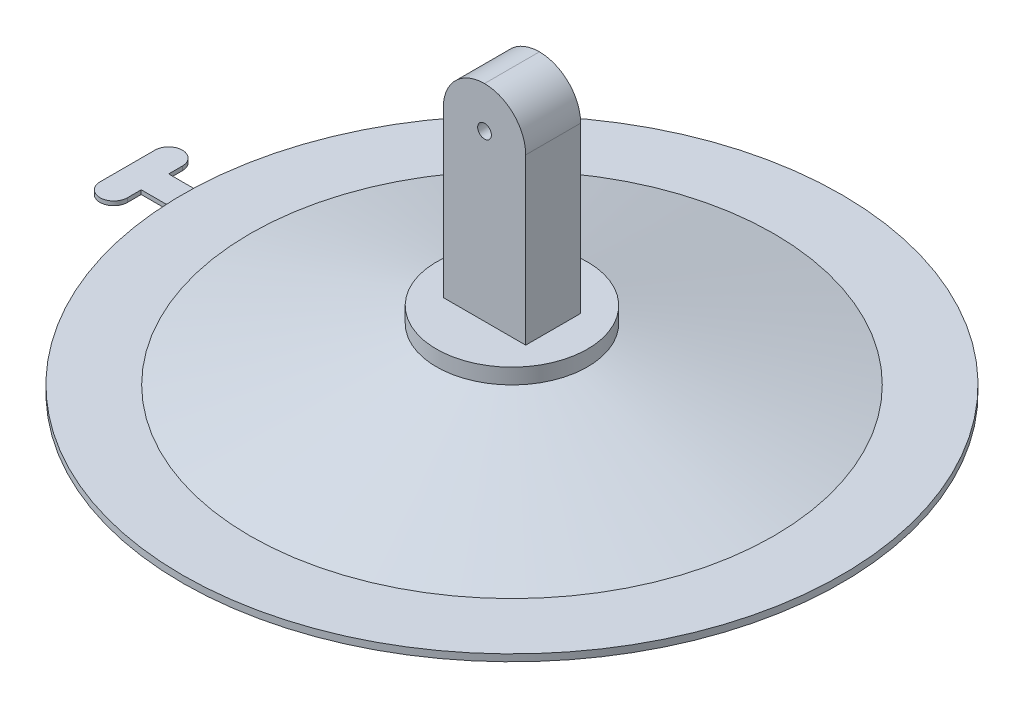
ISO-10303-21;
HEADER;
FILE_DESCRIPTION(('STEP AP214'),'2;1');
FILE_NAME('part.step','',(''),(''),'','','');
FILE_SCHEMA(('AUTOMOTIVE_DESIGN { 1 0 10303 214 1 1 1 1 }'));
ENDSEC;
DATA;
#1=APPLICATION_CONTEXT('core data for automotive mechanical design processes');
#2=APPLICATION_PROTOCOL_DEFINITION('international standard','automotive_design',2000,#1);
#3=PRODUCT_CONTEXT('',#1,'mechanical');
#4=PRODUCT('Part','Part','',(#3));
#5=PRODUCT_RELATED_PRODUCT_CATEGORY('part','',(#4));
#6=PRODUCT_DEFINITION_FORMATION('','',#4);
#7=PRODUCT_DEFINITION_CONTEXT('part definition',#1,'design');
#8=PRODUCT_DEFINITION('design','',#6,#7);
#9=PRODUCT_DEFINITION_SHAPE('','',#8);
#10=(LENGTH_UNIT() NAMED_UNIT(*) SI_UNIT(.MILLI.,.METRE.));
#11=(NAMED_UNIT(*) PLANE_ANGLE_UNIT() SI_UNIT($,.RADIAN.));
#12=(NAMED_UNIT(*) SI_UNIT($,.STERADIAN.) SOLID_ANGLE_UNIT());
#13=UNCERTAINTY_MEASURE_WITH_UNIT(LENGTH_MEASURE(1.E-05),#10,'distance_accuracy_value','');
#14=(GEOMETRIC_REPRESENTATION_CONTEXT(3) GLOBAL_UNCERTAINTY_ASSIGNED_CONTEXT((#13)) GLOBAL_UNIT_ASSIGNED_CONTEXT((#10,
#11,#12)) REPRESENTATION_CONTEXT('',''));
#15=CARTESIAN_POINT('',(0.,0.,0.));
#16=DIRECTION('',(0.,0.,1.));
#17=DIRECTION('',(1.,0.,0.));
#18=AXIS2_PLACEMENT_3D('',#15,#16,#17);
#19=CARTESIAN_POINT('',(-3.,20.5,-2.));
#20=DIRECTION('',(1.,0.,0.));
#21=DIRECTION('',(0.,0.,-1.));
#22=AXIS2_PLACEMENT_3D('',#19,#20,#21);
#23=PLANE('',#22);
#24=DIRECTION('',(0.,-1.,0.));
#25=VECTOR('',#24,1.);
#26=CARTESIAN_POINT('',(-3.,20.5,2.));
#27=LINE('',#26,#25);
#28=CARTESIAN_POINT('',(-3.,17.5,2.));
#29=VERTEX_POINT('',#28);
#30=CARTESIAN_POINT('',(-3.,5.5,2.));
#31=VERTEX_POINT('',#30);
#32=EDGE_CURVE('E96',#29,#31,#27,.T.);
#33=ORIENTED_EDGE('',*,*,#32,.F.);
#34=DIRECTION('',(0.,0.,1.));
#35=VECTOR('',#34,1.);
#36=CARTESIAN_POINT('',(-3.,17.5,-2.));
#37=LINE('',#36,#35);
#38=CARTESIAN_POINT('',(-3.,17.5,-2.));
#39=VERTEX_POINT('',#38);
#40=EDGE_CURVE('E136',#29,#39,#37,.F.);
#41=ORIENTED_EDGE('',*,*,#40,.T.);
#42=DIRECTION('',(0.,-1.,0.));
#43=VECTOR('',#42,1.);
#44=CARTESIAN_POINT('',(-3.,20.5,-2.));
#45=LINE('',#44,#43);
#46=CARTESIAN_POINT('',(-3.,5.5,-2.));
#47=VERTEX_POINT('',#46);
#48=EDGE_CURVE('E119',#39,#47,#45,.T.);
#49=ORIENTED_EDGE('',*,*,#48,.T.);
#50=DIRECTION('',(0.,0.,1.));
#51=VECTOR('',#50,1.);
#52=CARTESIAN_POINT('',(-3.,5.5,-2.));
#53=LINE('',#52,#51);
#54=EDGE_CURVE('E115',#47,#31,#53,.T.);
#55=ORIENTED_EDGE('',*,*,#54,.T.);
#56=EDGE_LOOP('',(#33,#41,#49,#55));
#57=FACE_BOUND('',#56,.T.);
#58=ADVANCED_FACE('F52',(#57),#23,.F.);
#59=CARTESIAN_POINT('',(3.,20.5,2.));
#60=DIRECTION('',(0.,0.,-1.));
#61=DIRECTION('',(-1.,0.,0.));
#62=AXIS2_PLACEMENT_3D('',#59,#60,#61);
#63=PLANE('',#62);
#64=CARTESIAN_POINT('',(0.,17.5,2.));
#65=DIRECTION('',(0.,0.,-1.));
#66=DIRECTION('',(-1.,0.,0.));
#67=AXIS2_PLACEMENT_3D('',#64,#65,#66);
#68=CIRCLE('',#67,0.5);
#69=CARTESIAN_POINT('',(-0.5,17.5,2.));
#70=VERTEX_POINT('',#69);
#71=EDGE_CURVE('E123',#70,#70,#68,.T.);
#72=ORIENTED_EDGE('',*,*,#71,.T.);
#73=EDGE_LOOP('',(#72));
#74=FACE_BOUND('',#73,.T.);
#75=CARTESIAN_POINT('',(0.,17.5,2.));
#76=DIRECTION('',(0.,0.,-1.));
#77=DIRECTION('',(-1.,0.,0.));
#78=AXIS2_PLACEMENT_3D('',#75,#76,#77);
#79=CIRCLE('',#78,3.);
#80=CARTESIAN_POINT('',(3.,17.5,2.));
#81=VERTEX_POINT('',#80);
#82=CARTESIAN_POINT('',(0.,20.5,2.));
#83=VERTEX_POINT('',#82);
#84=EDGE_CURVE('E108',#81,#83,#79,.F.);
#85=ORIENTED_EDGE('',*,*,#84,.T.);
#86=CARTESIAN_POINT('',(0.,17.5,2.));
#87=DIRECTION('',(0.,0.,-1.));
#88=DIRECTION('',(-1.,0.,0.));
#89=AXIS2_PLACEMENT_3D('',#86,#87,#88);
#90=CIRCLE('',#89,3.);
#91=EDGE_CURVE('E103',#83,#29,#90,.F.);
#92=ORIENTED_EDGE('',*,*,#91,.T.);
#93=ORIENTED_EDGE('',*,*,#32,.T.);
#94=DIRECTION('',(1.,0.,0.));
#95=VECTOR('',#94,1.);
#96=CARTESIAN_POINT('',(3.,5.5,2.));
#97=LINE('',#96,#95);
#98=CARTESIAN_POINT('',(3.,5.5,2.));
#99=VERTEX_POINT('',#98);
#100=EDGE_CURVE('E100',#31,#99,#97,.T.);
#101=ORIENTED_EDGE('',*,*,#100,.T.);
#102=DIRECTION('',(0.,-1.,0.));
#103=VECTOR('',#102,1.);
#104=CARTESIAN_POINT('',(3.,20.5,2.));
#105=LINE('',#104,#103);
#106=EDGE_CURVE('E109',#81,#99,#105,.T.);
#107=ORIENTED_EDGE('',*,*,#106,.F.);
#108=EDGE_LOOP('',(#85,#92,#93,#101,#107));
#109=FACE_BOUND('',#108,.T.);
#110=ADVANCED_FACE('F98',(#74,#109),#63,.F.);
#111=CARTESIAN_POINT('',(3.,20.5,-2.));
#112=DIRECTION('',(-1.,0.,0.));
#113=DIRECTION('',(0.,0.,1.));
#114=AXIS2_PLACEMENT_3D('',#111,#112,#113);
#115=PLANE('',#114);
#116=DIRECTION('',(0.,-1.,0.));
#117=VECTOR('',#116,1.);
#118=CARTESIAN_POINT('',(3.,20.5,-2.));
#119=LINE('',#118,#117);
#120=CARTESIAN_POINT('',(3.,17.5,-2.));
#121=VERTEX_POINT('',#120);
#122=CARTESIAN_POINT('',(3.,5.5,-2.));
#123=VERTEX_POINT('',#122);
#124=EDGE_CURVE('E131',#121,#123,#119,.T.);
#125=ORIENTED_EDGE('',*,*,#124,.F.);
#126=DIRECTION('',(0.,0.,-1.));
#127=VECTOR('',#126,1.);
#128=CARTESIAN_POINT('',(3.,17.5,-2.));
#129=LINE('',#128,#127);
#130=EDGE_CURVE('E12',#121,#81,#129,.F.);
#131=ORIENTED_EDGE('',*,*,#130,.T.);
#132=ORIENTED_EDGE('',*,*,#106,.T.);
#133=DIRECTION('',(0.,0.,-1.));
#134=VECTOR('',#133,1.);
#135=CARTESIAN_POINT('',(3.,5.5,-2.));
#136=LINE('',#135,#134);
#137=EDGE_CURVE('E117',#99,#123,#136,.T.);
#138=ORIENTED_EDGE('',*,*,#137,.T.);
#139=EDGE_LOOP('',(#125,#131,#132,#138));
#140=FACE_BOUND('',#139,.T.);
#141=ADVANCED_FACE('F143',(#140),#115,.F.);
#142=CARTESIAN_POINT('',(3.,20.5,-2.));
#143=DIRECTION('',(0.,0.,1.));
#144=DIRECTION('',(1.,0.,0.));
#145=AXIS2_PLACEMENT_3D('',#142,#143,#144);
#146=PLANE('',#145);
#147=CARTESIAN_POINT('',(0.,17.5,-2.));
#148=DIRECTION('',(0.,0.,-1.));
#149=DIRECTION('',(-1.,0.,0.));
#150=AXIS2_PLACEMENT_3D('',#147,#148,#149);
#151=CIRCLE('',#150,0.5);
#152=CARTESIAN_POINT('',(-0.5,17.5,-2.));
#153=VERTEX_POINT('',#152);
#154=EDGE_CURVE('E216',#153,#153,#151,.T.);
#155=ORIENTED_EDGE('',*,*,#154,.F.);
#156=EDGE_LOOP('',(#155));
#157=FACE_BOUND('',#156,.T.);
#158=ORIENTED_EDGE('',*,*,#48,.F.);
#159=CARTESIAN_POINT('',(0.,17.5,-2.));
#160=DIRECTION('',(0.,0.,1.));
#161=DIRECTION('',(1.,0.,0.));
#162=AXIS2_PLACEMENT_3D('',#159,#160,#161);
#163=CIRCLE('',#162,3.);
#164=CARTESIAN_POINT('',(0.,20.5,-2.));
#165=VERTEX_POINT('',#164);
#166=EDGE_CURVE('E61',#39,#165,#163,.F.);
#167=ORIENTED_EDGE('',*,*,#166,.T.);
#168=CARTESIAN_POINT('',(0.,17.5,-2.));
#169=DIRECTION('',(0.,0.,1.));
#170=DIRECTION('',(1.,0.,0.));
#171=AXIS2_PLACEMENT_3D('',#168,#169,#170);
#172=CIRCLE('',#171,3.);
#173=EDGE_CURVE('E68',#165,#121,#172,.F.);
#174=ORIENTED_EDGE('',*,*,#173,.T.);
#175=ORIENTED_EDGE('',*,*,#124,.T.);
#176=DIRECTION('',(-1.,0.,0.));
#177=VECTOR('',#176,1.);
#178=CARTESIAN_POINT('',(3.,5.5,-2.));
#179=LINE('',#178,#177);
#180=EDGE_CURVE('E128',#123,#47,#179,.T.);
#181=ORIENTED_EDGE('',*,*,#180,.T.);
#182=EDGE_LOOP('',(#158,#167,#174,#175,#181));
#183=FACE_BOUND('',#182,.T.);
#184=ADVANCED_FACE('F140',(#157,#183),#146,.F.);
#185=CARTESIAN_POINT('',(0.,5.5,0.));
#186=DIRECTION('',(0.,-1.,0.));
#187=DIRECTION('',(0.,0.,-1.));
#188=AXIS2_PLACEMENT_3D('',#185,#186,#187);
#189=PLANE('',#188);
#190=ORIENTED_EDGE('',*,*,#54,.F.);
#191=ORIENTED_EDGE('',*,*,#180,.F.);
#192=ORIENTED_EDGE('',*,*,#137,.F.);
#193=ORIENTED_EDGE('',*,*,#100,.F.);
#194=EDGE_LOOP('',(#190,#191,#192,#193));
#195=FACE_BOUND('',#194,.T.);
#196=ADVANCED_FACE('F113',(#195),#189,.T.);
#197=CARTESIAN_POINT('',(0.,17.5,0.));
#198=DIRECTION('',(0.,0.,-1.));
#199=DIRECTION('',(-1.,0.,0.));
#200=AXIS2_PLACEMENT_3D('',#197,#198,#199);
#201=CYLINDRICAL_SURFACE('',#200,3.);
#202=ORIENTED_EDGE('',*,*,#130,.F.);
#203=ORIENTED_EDGE('',*,*,#173,.F.);
#204=DIRECTION('',(0.,0.,-1.));
#205=VECTOR('',#204,1.);
#206=CARTESIAN_POINT('',(0.,20.5,0.));
#207=LINE('',#206,#205);
#208=EDGE_CURVE('E56',#83,#165,#207,.T.);
#209=ORIENTED_EDGE('',*,*,#208,.F.);
#210=ORIENTED_EDGE('',*,*,#84,.F.);
#211=EDGE_LOOP('',(#202,#203,#209,#210));
#212=FACE_BOUND('',#211,.T.);
#213=ADVANCED_FACE('F54',(#212),#201,.T.);
#214=CARTESIAN_POINT('',(0.,17.5,0.));
#215=DIRECTION('',(0.,0.,1.));
#216=DIRECTION('',(1.,0.,0.));
#217=AXIS2_PLACEMENT_3D('',#214,#215,#216);
#218=CYLINDRICAL_SURFACE('',#217,3.);
#219=ORIENTED_EDGE('',*,*,#166,.F.);
#220=ORIENTED_EDGE('',*,*,#40,.F.);
#221=ORIENTED_EDGE('',*,*,#91,.F.);
#222=ORIENTED_EDGE('',*,*,#208,.T.);
#223=EDGE_LOOP('',(#219,#220,#221,#222));
#224=FACE_BOUND('',#223,.T.);
#225=ADVANCED_FACE('F147',(#224),#218,.T.);
#226=CARTESIAN_POINT('',(0.,17.5,3.));
#227=DIRECTION('',(0.,0.,-1.));
#228=DIRECTION('',(-1.,0.,0.));
#229=AXIS2_PLACEMENT_3D('',#226,#227,#228);
#230=CYLINDRICAL_SURFACE('',#229,0.5);
#231=ORIENTED_EDGE('',*,*,#154,.T.);
#232=EDGE_LOOP('',(#231));
#233=FACE_BOUND('',#232,.T.);
#234=ORIENTED_EDGE('',*,*,#71,.F.);
#235=EDGE_LOOP('',(#234));
#236=FACE_BOUND('',#235,.T.);
#237=ADVANCED_FACE('F149',(#233,#236),#230,.F.);
#238=CLOSED_SHELL('',(#58,#110,#141,#184,#196,#213,#225,#237));
#239=MANIFOLD_SOLID_BREP('B2',#238);
#240=CARTESIAN_POINT('',(0.,0.,0.));
#241=DIRECTION('',(0.,-1.,0.));
#242=DIRECTION('',(0.,0.,-1.));
#243=AXIS2_PLACEMENT_3D('',#240,#241,#242);
#244=CYLINDRICAL_SURFACE('',#243,24.);
#245=CARTESIAN_POINT('',(0.,0.499999999999996,0.));
#246=DIRECTION('',(0.,1.,0.));
#247=DIRECTION('',(0.,0.,1.));
#248=AXIS2_PLACEMENT_3D('',#245,#246,#247);
#249=CIRCLE('',#248,24.);
#250=CARTESIAN_POINT('',(0.,0.499999999999996,24.));
#251=VERTEX_POINT('',#250);
#252=EDGE_CURVE('E322',#251,#251,#249,.T.);
#253=ORIENTED_EDGE('',*,*,#252,.F.);
#254=EDGE_LOOP('',(#253));
#255=FACE_BOUND('',#254,.T.);
#256=CARTESIAN_POINT('',(0.,0.3,0.));
#257=DIRECTION('',(0.,1.,0.));
#258=DIRECTION('',(0.,0.,1.));
#259=AXIS2_PLACEMENT_3D('',#256,#257,#258);
#260=CIRCLE('',#259,24.);
#261=CARTESIAN_POINT('',(-23.9791576165636,0.3,1.));
#262=VERTEX_POINT('',#261);
#263=CARTESIAN_POINT('',(-23.9791576165636,0.3,-0.999999999999997));
#264=VERTEX_POINT('',#263);
#265=EDGE_CURVE('E50',#262,#264,#260,.F.);
#266=ORIENTED_EDGE('',*,*,#265,.F.);
#267=DIRECTION('',(0.,-1.,0.));
#268=VECTOR('',#267,1.);
#269=CARTESIAN_POINT('',(-23.9791576165636,0.,1.));
#270=LINE('',#269,#268);
#271=CARTESIAN_POINT('',(-23.9791576165636,0.,1.));
#272=VERTEX_POINT('',#271);
#273=EDGE_CURVE('E310',#262,#272,#270,.T.);
#274=ORIENTED_EDGE('',*,*,#273,.T.);
#275=CARTESIAN_POINT('',(0.,0.,0.));
#276=DIRECTION('',(0.,1.,0.));
#277=DIRECTION('',(0.,0.,1.));
#278=AXIS2_PLACEMENT_3D('',#275,#276,#277);
#279=CIRCLE('',#278,24.);
#280=CARTESIAN_POINT('',(-23.9791576165636,0.,-0.999999999999997));
#281=VERTEX_POINT('',#280);
#282=EDGE_CURVE('E229',#272,#281,#279,.T.);
#283=ORIENTED_EDGE('',*,*,#282,.T.);
#284=DIRECTION('',(0.,-1.,0.));
#285=VECTOR('',#284,1.);
#286=CARTESIAN_POINT('',(-23.9791576165636,0.,-0.999999999999997));
#287=LINE('',#286,#285);
#288=EDGE_CURVE('E236',#281,#264,#287,.F.);
#289=ORIENTED_EDGE('',*,*,#288,.T.);
#290=EDGE_LOOP('',(#266,#274,#283,#289));
#291=FACE_BOUND('',#290,.T.);
#292=ADVANCED_FACE('F222',(#255,#291),#244,.T.);
#293=CARTESIAN_POINT('',(-24.,0.,0.));
#294=DIRECTION('',(0.,-1.,0.));
#295=DIRECTION('',(0.,0.,-1.));
#296=AXIS2_PLACEMENT_3D('',#293,#294,#295);
#297=PLANE('',#296);
#298=ORIENTED_EDGE('',*,*,#282,.F.);
#299=DIRECTION('',(1.,0.,0.));
#300=VECTOR('',#299,1.);
#301=CARTESIAN_POINT('',(-23.,0.,1.));
#302=LINE('',#301,#300);
#303=CARTESIAN_POINT('',(-26.,0.,1.));
#304=VERTEX_POINT('',#303);
#305=EDGE_CURVE('E523',#304,#272,#302,.T.);
#306=ORIENTED_EDGE('',*,*,#305,.F.);
#307=DIRECTION('',(0.,0.,-1.));
#308=VECTOR('',#307,1.);
#309=CARTESIAN_POINT('',(-26.,0.,1.));
#310=LINE('',#309,#308);
#311=CARTESIAN_POINT('',(-26.,0.,2.));
#312=VERTEX_POINT('',#311);
#313=EDGE_CURVE('E521',#312,#304,#310,.T.);
#314=ORIENTED_EDGE('',*,*,#313,.F.);
#315=CARTESIAN_POINT('',(-27.,0.,2.));
#316=DIRECTION('',(0.,1.,0.));
#317=DIRECTION('',(0.,0.,1.));
#318=AXIS2_PLACEMENT_3D('',#315,#316,#317);
#319=CIRCLE('',#318,1.);
#320=CARTESIAN_POINT('',(-28.,0.,2.));
#321=VERTEX_POINT('',#320);
#322=EDGE_CURVE('E515',#321,#312,#319,.T.);
#323=ORIENTED_EDGE('',*,*,#322,.F.);
#324=DIRECTION('',(0.,0.,1.));
#325=VECTOR('',#324,1.);
#326=CARTESIAN_POINT('',(-28.,0.,-2.));
#327=LINE('',#326,#325);
#328=CARTESIAN_POINT('',(-28.,0.,-2.));
#329=VERTEX_POINT('',#328);
#330=EDGE_CURVE('E513',#329,#321,#327,.T.);
#331=ORIENTED_EDGE('',*,*,#330,.F.);
#332=CARTESIAN_POINT('',(-27.,0.,-2.));
#333=DIRECTION('',(0.,1.,0.));
#334=DIRECTION('',(0.,0.,1.));
#335=AXIS2_PLACEMENT_3D('',#332,#333,#334);
#336=CIRCLE('',#335,1.);
#337=CARTESIAN_POINT('',(-26.,0.,-2.));
#338=VERTEX_POINT('',#337);
#339=EDGE_CURVE('E308',#338,#329,#336,.T.);
#340=ORIENTED_EDGE('',*,*,#339,.F.);
#341=DIRECTION('',(0.,0.,-1.));
#342=VECTOR('',#341,1.);
#343=CARTESIAN_POINT('',(-26.,0.,-2.));
#344=LINE('',#343,#342);
#345=CARTESIAN_POINT('',(-26.,0.,-0.999999999999997));
#346=VERTEX_POINT('',#345);
#347=EDGE_CURVE('E304',#346,#338,#344,.T.);
#348=ORIENTED_EDGE('',*,*,#347,.F.);
#349=DIRECTION('',(-1.,0.,0.));
#350=VECTOR('',#349,1.);
#351=CARTESIAN_POINT('',(-23.,0.,-0.999999999999997));
#352=LINE('',#351,#350);
#353=EDGE_CURVE('E509',#281,#346,#352,.T.);
#354=ORIENTED_EDGE('',*,*,#353,.F.);
#355=EDGE_LOOP('',(#298,#306,#314,#323,#331,#340,#348,#354));
#356=FACE_BOUND('',#355,.T.);
#357=CARTESIAN_POINT('',(0.,0.,0.));
#358=DIRECTION('',(0.,1.,0.));
#359=DIRECTION('',(0.,0.,1.));
#360=AXIS2_PLACEMENT_3D('',#357,#358,#359);
#361=CIRCLE('',#360,19.);
#362=CARTESIAN_POINT('',(0.,0.,-19.));
#363=VERTEX_POINT('',#362);
#364=EDGE_CURVE('E325',#363,#363,#361,.T.);
#365=ORIENTED_EDGE('',*,*,#364,.T.);
#366=EDGE_LOOP('',(#365));
#367=FACE_BOUND('',#366,.T.);
#368=ADVANCED_FACE('F342',(#356,#367),#297,.T.);
#369=CARTESIAN_POINT('',(0.,0.,0.));
#370=DIRECTION('',(0.,-1.,0.));
#371=DIRECTION('',(0.,0.,-1.));
#372=AXIS2_PLACEMENT_3D('',#369,#370,#371);
#373=CONICAL_SURFACE('',#372,19.,1.29249666778979);
#374=CARTESIAN_POINT('',(0.,4.,0.));
#375=DIRECTION('',(0.,1.,0.));
#376=DIRECTION('',(0.,0.,1.));
#377=AXIS2_PLACEMENT_3D('',#374,#375,#376);
#378=CIRCLE('',#377,5.);
#379=CARTESIAN_POINT('',(0.,4.,-5.00000000000001));
#380=VERTEX_POINT('',#379);
#381=EDGE_CURVE('E321',#380,#380,#378,.T.);
#382=CARTESIAN_POINT('',(0.,4.,-5.00000000000001));
#383=CARTESIAN_POINT('',(0.,3.95833333333333,-5.14583333333334));
#384=CARTESIAN_POINT('',(0.,3.91666666666666,-5.29166666666667));
#385=CARTESIAN_POINT('',(0.,3.83333333333333,-5.58333333333334));
#386=CARTESIAN_POINT('',(0.,3.79166666666667,-5.72916666666667));
#387=CARTESIAN_POINT('',(0.,3.70833333333333,-6.02083333333334));
#388=CARTESIAN_POINT('',(0.,3.66666666666666,-6.16666666666667));
#389=CARTESIAN_POINT('',(0.,3.58333333333333,-6.45833333333334));
#390=CARTESIAN_POINT('',(0.,3.54166666666667,-6.60416666666667));
#391=CARTESIAN_POINT('',(0.,3.45833333333333,-6.89583333333334));
#392=CARTESIAN_POINT('',(0.,3.41666666666667,-7.04166666666667));
#393=CARTESIAN_POINT('',(0.,3.33333333333333,-7.33333333333334));
#394=CARTESIAN_POINT('',(0.,3.29166666666667,-7.47916666666667));
#395=CARTESIAN_POINT('',(0.,3.20833333333333,-7.77083333333334));
#396=CARTESIAN_POINT('',(0.,3.16666666666667,-7.91666666666667));
#397=CARTESIAN_POINT('',(0.,3.08333333333333,-8.20833333333334));
#398=CARTESIAN_POINT('',(0.,3.04166666666667,-8.35416666666667));
#399=CARTESIAN_POINT('',(0.,2.95833333333333,-8.64583333333334));
#400=CARTESIAN_POINT('',(0.,2.91666666666667,-8.79166666666667));
#401=CARTESIAN_POINT('',(0.,2.83333333333333,-9.08333333333334));
#402=CARTESIAN_POINT('',(0.,2.79166666666666,-9.22916666666667));
#403=CARTESIAN_POINT('',(0.,2.70833333333333,-9.52083333333334));
#404=CARTESIAN_POINT('',(0.,2.66666666666666,-9.66666666666667));
#405=CARTESIAN_POINT('',(0.,2.58333333333333,-9.95833333333334));
#406=CARTESIAN_POINT('',(0.,2.54166666666667,-10.1041666666667));
#407=CARTESIAN_POINT('',(0.,2.45833333333333,-10.3958333333333));
#408=CARTESIAN_POINT('',(0.,2.41666666666667,-10.5416666666667));
#409=CARTESIAN_POINT('',(0.,2.33333333333333,-10.8333333333333));
#410=CARTESIAN_POINT('',(0.,2.29166666666666,-10.9791666666667));
#411=CARTESIAN_POINT('',(0.,2.20833333333333,-11.2708333333333));
#412=CARTESIAN_POINT('',(0.,2.16666666666667,-11.4166666666667));
#413=CARTESIAN_POINT('',(0.,2.08333333333333,-11.7083333333333));
#414=CARTESIAN_POINT('',(0.,2.04166666666667,-11.8541666666667));
#415=CARTESIAN_POINT('',(0.,1.95833333333333,-12.1458333333333));
#416=CARTESIAN_POINT('',(0.,1.91666666666666,-12.2916666666667));
#417=CARTESIAN_POINT('',(0.,1.83333333333333,-12.5833333333333));
#418=CARTESIAN_POINT('',(0.,1.79166666666666,-12.7291666666667));
#419=CARTESIAN_POINT('',(0.,1.70833333333333,-13.0208333333333));
#420=CARTESIAN_POINT('',(0.,1.66666666666666,-13.1666666666667));
#421=CARTESIAN_POINT('',(0.,1.58333333333333,-13.4583333333333));
#422=CARTESIAN_POINT('',(0.,1.54166666666666,-13.6041666666667));
#423=CARTESIAN_POINT('',(0.,1.45833333333333,-13.8958333333333));
#424=CARTESIAN_POINT('',(0.,1.41666666666666,-14.0416666666667));
#425=CARTESIAN_POINT('',(0.,1.33333333333333,-14.3333333333333));
#426=CARTESIAN_POINT('',(0.,1.29166666666667,-14.4791666666667));
#427=CARTESIAN_POINT('',(0.,1.20833333333333,-14.7708333333333));
#428=CARTESIAN_POINT('',(0.,1.16666666666666,-14.9166666666667));
#429=CARTESIAN_POINT('',(0.,1.08333333333333,-15.2083333333333));
#430=CARTESIAN_POINT('',(0.,1.04166666666667,-15.3541666666667));
#431=CARTESIAN_POINT('',(0.,0.958333333333332,-15.6458333333333));
#432=CARTESIAN_POINT('',(0.,0.916666666666665,-15.7916666666667));
#433=CARTESIAN_POINT('',(0.,0.833333333333331,-16.0833333333333));
#434=CARTESIAN_POINT('',(0.,0.791666666666665,-16.2291666666667));
#435=CARTESIAN_POINT('',(0.,0.708333333333331,-16.5208333333333));
#436=CARTESIAN_POINT('',(0.,0.666666666666665,-16.6666666666667));
#437=CARTESIAN_POINT('',(0.,0.583333333333332,-16.9583333333333));
#438=CARTESIAN_POINT('',(0.,0.541666666666665,-17.1041666666667));
#439=CARTESIAN_POINT('',(0.,0.458333333333332,-17.3958333333333));
#440=CARTESIAN_POINT('',(0.,0.416666666666665,-17.5416666666667));
#441=CARTESIAN_POINT('',(0.,0.333333333333332,-17.8333333333333));
#442=CARTESIAN_POINT('',(0.,0.291666666666665,-17.9791666666667));
#443=CARTESIAN_POINT('',(0.,0.208333333333332,-18.2708333333333));
#444=CARTESIAN_POINT('',(0.,0.166666666666665,-18.4166666666667));
#445=CARTESIAN_POINT('',(0.,0.0833333333333318,-18.7083333333333));
#446=CARTESIAN_POINT('',(0.,0.0416666666666651,-18.8541666666667));
#447=CARTESIAN_POINT('',(0.,0.,-19.));
#448=B_SPLINE_CURVE_WITH_KNOTS('',3,(#382,#383,#384,#385,#386,#387,#388,#389,#390,#391,#392,
#393,#394,#395,#396,#397,#398,#399,#400,#401,#402,#403,#404,#405,#406,#407,#408,#409,#410,#411,
#412,#413,#414,#415,#416,#417,#418,#419,#420,#421,#422,#423,#424,#425,#426,#427,#428,#429,#430,
#431,#432,#433,#434,#435,#436,#437,#438,#439,#440,#441,#442,#443,#444,#445,#446,#447),
.UNSPECIFIED.,.F.,.F.,(4,2,2,2,2,2,2,2,2,2,2,2,2,2,2,2,2,2,2,2,2,2,2,2,2,2,2,2,2,2,2,2,4),(0.,
0.455006868080033,0.910013736160066,1.3650206042401,1.82002747232013,2.27503434040016,
2.73004120848019,3.18504807656022,3.64005494464026,4.09506181272029,4.55006868080032,
5.00507554888035,5.46008241696039,5.91508928504042,6.37009615312045,6.82510302120048,
7.28010988928052,7.73511675736055,8.19012362544058,8.64513049352061,9.10013736160064,
9.55514422968068,10.0101510977607,10.4651579658407,10.9201648339208,11.3751717020008,
11.8301785700808,12.2851854381609,12.7401923062409,13.1951991743209,13.650206042401,
14.105212910481,14.560219778561),.UNSPECIFIED.);
#449=EDGE_CURVE('BSEAM346',#380,#363,#448,.T.);
#450=ORIENTED_EDGE('',*,*,#381,.T.);
#451=ORIENTED_EDGE('',*,*,#364,.F.);
#452=ORIENTED_EDGE('',*,*,#449,.T.);
#453=ORIENTED_EDGE('',*,*,#449,.F.);
#454=EDGE_LOOP('',(#450,#452,#451,#453));
#455=FACE_BOUND('',#454,.T.);
#456=ADVANCED_FACE('F346',(#455),#373,.F.);
#457=CARTESIAN_POINT('',(0.,0.,0.));
#458=DIRECTION('',(0.,1.,0.));
#459=DIRECTION('',(0.,0.,1.));
#460=AXIS2_PLACEMENT_3D('',#457,#458,#459);
#461=CYLINDRICAL_SURFACE('',#460,5.);
#462=CARTESIAN_POINT('',(0.,5.,0.));
#463=DIRECTION('',(0.,1.,0.));
#464=DIRECTION('',(0.,0.,1.));
#465=AXIS2_PLACEMENT_3D('',#462,#463,#464);
#466=CIRCLE('',#465,5.);
#467=CARTESIAN_POINT('',(0.,5.,5.));
#468=VERTEX_POINT('',#467);
#469=EDGE_CURVE('E318',#468,#468,#466,.T.);
#470=ORIENTED_EDGE('',*,*,#469,.T.);
#471=EDGE_LOOP('',(#470));
#472=FACE_BOUND('',#471,.T.);
#473=ORIENTED_EDGE('',*,*,#381,.F.);
#474=EDGE_LOOP('',(#473));
#475=FACE_BOUND('',#474,.T.);
#476=ADVANCED_FACE('F352',(#472,#475),#461,.F.);
#477=CARTESIAN_POINT('',(-5.,5.,0.));
#478=DIRECTION('',(0.,-1.,0.));
#479=DIRECTION('',(0.,0.,-1.));
#480=AXIS2_PLACEMENT_3D('',#477,#478,#479);
#481=PLANE('',#480);
#482=ORIENTED_EDGE('',*,*,#469,.F.);
#483=EDGE_LOOP('',(#482));
#484=FACE_BOUND('',#483,.T.);
#485=ADVANCED_FACE('F361',(#484),#481,.T.);
#486=CARTESIAN_POINT('',(-24.,0.499999999999997,0.));
#487=DIRECTION('',(0.,-1.,0.));
#488=DIRECTION('',(0.,0.,-1.));
#489=AXIS2_PLACEMENT_3D('',#486,#487,#488);
#490=PLANE('',#489);
#491=CARTESIAN_POINT('',(0.,0.499999999999997,0.));
#492=DIRECTION('',(0.,-1.,0.));
#493=DIRECTION('',(0.,0.,-1.));
#494=AXIS2_PLACEMENT_3D('',#491,#492,#493);
#495=CIRCLE('',#494,19.0700274723201);
#496=CARTESIAN_POINT('',(0.,0.499999999999997,-19.0700274723201));
#497=VERTEX_POINT('',#496);
#498=EDGE_CURVE('E329',#497,#497,#495,.F.);
#499=ORIENTED_EDGE('',*,*,#498,.F.);
#500=EDGE_LOOP('',(#499));
#501=FACE_BOUND('',#500,.T.);
#502=ORIENTED_EDGE('',*,*,#252,.T.);
#503=EDGE_LOOP('',(#502));
#504=FACE_BOUND('',#503,.T.);
#505=ADVANCED_FACE('F339',(#501,#504),#490,.F.);
#506=CARTESIAN_POINT('',(0.,0.48076197382041,0.));
#507=DIRECTION('',(0.,-1.,0.));
#508=DIRECTION('',(0.,0.,-1.));
#509=AXIS2_PLACEMENT_3D('',#506,#507,#508);
#510=CONICAL_SURFACE('',#509,19.1373605639487,1.29249666778979);
#511=CARTESIAN_POINT('',(0.,4.37715070637718,0.));
#512=DIRECTION('',(0.,-1.,0.));
#513=DIRECTION('',(0.,0.,-1.));
#514=AXIS2_PLACEMENT_3D('',#511,#512,#513);
#515=CIRCLE('',#514,5.5);
#516=CARTESIAN_POINT('',(0.,4.37715070637718,-5.5));
#517=VERTEX_POINT('',#516);
#518=EDGE_CURVE('E332',#517,#517,#515,.F.);
#519=CARTESIAN_POINT('',(0.,4.37715070637718,-5.5));
#520=CARTESIAN_POINT('',(0.,4.33676371985242,-5.64135445283666));
#521=CARTESIAN_POINT('',(0.,4.29637673332766,-5.78270890567333));
#522=CARTESIAN_POINT('',(0.,4.21560276027813,-6.06541781134667));
#523=CARTESIAN_POINT('',(0.,4.17521577375337,-6.20677226418334));
#524=CARTESIAN_POINT('',(0.,4.09444180070385,-6.48948116985667));
#525=CARTESIAN_POINT('',(0.,4.05405481417908,-6.63083562269334));
#526=CARTESIAN_POINT('',(0.,3.97328084112956,-6.91354452836668));
#527=CARTESIAN_POINT('',(0.,3.9328938546048,-7.05489898120335));
#528=CARTESIAN_POINT('',(0.,3.85211988155527,-7.33760788687668));
#529=CARTESIAN_POINT('',(0.,3.81173289503051,-7.47896233971335));
#530=CARTESIAN_POINT('',(0.,3.73095892198098,-7.76167124538668));
#531=CARTESIAN_POINT('',(0.,3.69057193545622,-7.90302569822335));
#532=CARTESIAN_POINT('',(0.,3.6097979624067,-8.18573460389669));
#533=CARTESIAN_POINT('',(0.,3.56941097588193,-8.32708905673336));
#534=CARTESIAN_POINT('',(0.,3.48863700283241,-8.6097979624067));
#535=CARTESIAN_POINT('',(0.,3.44825001630765,-8.75115241524336));
#536=CARTESIAN_POINT('',(0.,3.36747604325812,-9.0338613209167));
#537=CARTESIAN_POINT('',(0.,3.32708905673336,-9.17521577375337));
#538=CARTESIAN_POINT('',(0.,3.24631508368384,-9.4579246794267));
#539=CARTESIAN_POINT('',(0.,3.20592809715907,-9.59927913226337));
#540=CARTESIAN_POINT('',(0.,3.12515412410955,-9.88198803793671));
#541=CARTESIAN_POINT('',(0.,3.08476713758479,-10.0233424907734));
#542=CARTESIAN_POINT('',(0.,3.00399316453526,-10.3060513964467));
#543=CARTESIAN_POINT('',(0.,2.9636061780105,-10.4474058492834));
#544=CARTESIAN_POINT('',(0.,2.88283220496097,-10.7301147549567));
#545=CARTESIAN_POINT('',(0.,2.84244521843621,-10.8714692077934));
#546=CARTESIAN_POINT('',(0.,2.76167124538669,-11.1541781134667));
#547=CARTESIAN_POINT('',(0.,2.72128425886193,-11.2955325663034));
#548=CARTESIAN_POINT('',(0.,2.6405102858124,-11.5782414719767));
#549=CARTESIAN_POINT('',(0.,2.60012329928764,-11.7195959248134));
#550=CARTESIAN_POINT('',(0.,2.51934932623811,-12.0023048304867));
#551=CARTESIAN_POINT('',(0.,2.47896233971335,-12.1436592833234));
#552=CARTESIAN_POINT('',(0.,2.39818836666383,-12.4263681889967));
#553=CARTESIAN_POINT('',(0.,2.35780138013906,-12.5677226418334));
#554=CARTESIAN_POINT('',(0.,2.27702740708954,-12.8504315475067));
#555=CARTESIAN_POINT('',(0.,2.23664042056478,-12.9917860003434));
#556=CARTESIAN_POINT('',(0.,2.15586644751525,-13.2744949060167));
#557=CARTESIAN_POINT('',(0.,2.11547946099049,-13.4158493588534));
#558=CARTESIAN_POINT('',(0.,2.03470548794097,-13.6985582645267));
#559=CARTESIAN_POINT('',(0.,1.9943185014162,-13.8399127173634));
#560=CARTESIAN_POINT('',(0.,1.91354452836668,-14.1226216230368));
#561=CARTESIAN_POINT('',(0.,1.87315754184192,-14.2639760758734));
#562=CARTESIAN_POINT('',(0.,1.79238356879239,-14.5466849815468));
#563=CARTESIAN_POINT('',(0.,1.75199658226763,-14.6880394343834));
#564=CARTESIAN_POINT('',(0.,1.6712226092181,-14.9707483400568));
#565=CARTESIAN_POINT('',(0.,1.63083562269334,-15.1121027928934));
#566=CARTESIAN_POINT('',(0.,1.55006164964382,-15.3948116985668));
#567=CARTESIAN_POINT('',(0.,1.50967466311905,-15.5361661514034));
#568=CARTESIAN_POINT('',(0.,1.42890069006953,-15.8188750570768));
#569=CARTESIAN_POINT('',(0.,1.38851370354477,-15.9602295099134));
#570=CARTESIAN_POINT('',(0.,1.30773973049524,-16.2429384155868));
#571=CARTESIAN_POINT('',(0.,1.26735274397048,-16.3842928684234));
#572=CARTESIAN_POINT('',(0.,1.18657877092096,-16.6670017740968));
#573=CARTESIAN_POINT('',(0.,1.14619178439619,-16.8083562269334));
#574=CARTESIAN_POINT('',(0.,1.06541781134667,-17.0910651326068));
#575=CARTESIAN_POINT('',(0.,1.02503082482191,-17.2324195854434));
#576=CARTESIAN_POINT('',(0.,0.944256851772383,-17.5151284911168));
#577=CARTESIAN_POINT('',(0.,0.90386986524762,-17.6564829439535));
#578=CARTESIAN_POINT('',(0.,0.823095892198096,-17.9391918496268));
#579=CARTESIAN_POINT('',(0.,0.782708905673333,-18.0805463024635));
#580=CARTESIAN_POINT('',(0.,0.701934932623809,-18.3632552081368));
#581=CARTESIAN_POINT('',(0.,0.661547946099046,-18.5046096609735));
#582=CARTESIAN_POINT('',(0.,0.580773973049521,-18.7873185666468));
#583=CARTESIAN_POINT('',(0.,0.540386986524759,-18.9286730194835));
#584=CARTESIAN_POINT('',(0.,0.499999999999997,-19.0700274723201));
#585=B_SPLINE_CURVE_WITH_KNOTS('',3,(#519,#520,#521,#522,#523,#524,#525,#526,#527,#528,#529,
#530,#531,#532,#533,#534,#535,#536,#537,#538,#539,#540,#541,#542,#543,#544,#545,#546,#547,#548,
#549,#550,#551,#552,#553,#554,#555,#556,#557,#558,#559,#560,#561,#562,#563,#564,#565,#566,#567,
#568,#569,#570,#571,#572,#573,#574,#575,#576,#577,#578,#579,#580,#581,#582,#583,#584),
.UNSPECIFIED.,.F.,.F.,(4,2,2,2,2,2,2,2,2,2,2,2,2,2,2,2,2,2,2,2,2,2,2,2,2,2,2,2,2,2,2,2,4),(0.,
0.441032549995743,0.882065099991483,1.32309764998723,1.76413019998297,2.20516274997871,
2.64619529997445,3.08722784997019,3.52826039996593,3.96929294996168,4.41032549995742,
4.85135804995316,5.2923905999489,5.73342314994464,6.17445569994038,6.61548824993613,
7.05652079993187,7.49755334992761,7.93858589992335,8.37961844991909,8.82065099991483,
9.26168354991058,9.70271609990632,10.1437486499021,10.5847811998978,11.0258137498935,
11.4668462998893,11.907878849885,12.3489113998808,12.7899439498765,13.2309764998723,
13.672009049868,14.1130415998637),.UNSPECIFIED.);
#586=EDGE_CURVE('BSEAM360',#517,#497,#585,.T.);
#587=ORIENTED_EDGE('',*,*,#518,.F.);
#588=ORIENTED_EDGE('',*,*,#498,.T.);
#589=ORIENTED_EDGE('',*,*,#586,.T.);
#590=ORIENTED_EDGE('',*,*,#586,.F.);
#591=EDGE_LOOP('',(#587,#589,#588,#590));
#592=FACE_BOUND('',#591,.T.);
#593=ADVANCED_FACE('F360',(#592),#510,.T.);
#594=CARTESIAN_POINT('',(0.,0.,0.));
#595=DIRECTION('',(0.,1.,0.));
#596=DIRECTION('',(0.,0.,1.));
#597=AXIS2_PLACEMENT_3D('',#594,#595,#596);
#598=CYLINDRICAL_SURFACE('',#597,5.5);
#599=CARTESIAN_POINT('',(0.,5.5,0.));
#600=DIRECTION('',(0.,-1.,0.));
#601=DIRECTION('',(0.,0.,-1.));
#602=AXIS2_PLACEMENT_3D('',#599,#600,#601);
#603=CIRCLE('',#602,5.5);
#604=CARTESIAN_POINT('',(0.,5.5,-5.5));
#605=VERTEX_POINT('',#604);
#606=EDGE_CURVE('E317',#605,#605,#603,.F.);
#607=ORIENTED_EDGE('',*,*,#606,.F.);
#608=EDGE_LOOP('',(#607));
#609=FACE_BOUND('',#608,.T.);
#610=ORIENTED_EDGE('',*,*,#518,.T.);
#611=EDGE_LOOP('',(#610));
#612=FACE_BOUND('',#611,.T.);
#613=ADVANCED_FACE('F365',(#609,#612),#598,.T.);
#614=CARTESIAN_POINT('',(-5.,5.5,0.));
#615=DIRECTION('',(0.,-1.,0.));
#616=DIRECTION('',(0.,0.,-1.));
#617=AXIS2_PLACEMENT_3D('',#614,#615,#616);
#618=PLANE('',#617);
#619=ORIENTED_EDGE('',*,*,#606,.T.);
#620=EDGE_LOOP('',(#619));
#621=FACE_BOUND('',#620,.T.);
#622=ADVANCED_FACE('F368',(#621),#618,.F.);
#623=CARTESIAN_POINT('',(-27.,0.3,-2.));
#624=DIRECTION('',(0.,-1.,0.));
#625=DIRECTION('',(0.,0.,-1.));
#626=AXIS2_PLACEMENT_3D('',#623,#624,#625);
#627=CYLINDRICAL_SURFACE('',#626,1.);
#628=ORIENTED_EDGE('',*,*,#339,.T.);
#629=DIRECTION('',(0.,-1.,0.));
#630=VECTOR('',#629,1.);
#631=CARTESIAN_POINT('',(-28.,0.3,-2.));
#632=LINE('',#631,#630);
#633=CARTESIAN_POINT('',(-28.,0.3,-2.));
#634=VERTEX_POINT('',#633);
#635=EDGE_CURVE('E287',#634,#329,#632,.T.);
#636=ORIENTED_EDGE('',*,*,#635,.F.);
#637=CARTESIAN_POINT('',(-27.,0.3,-2.));
#638=DIRECTION('',(0.,1.,0.));
#639=DIRECTION('',(0.,0.,1.));
#640=AXIS2_PLACEMENT_3D('',#637,#638,#639);
#641=CIRCLE('',#640,1.);
#642=CARTESIAN_POINT('',(-26.,0.3,-2.));
#643=VERTEX_POINT('',#642);
#644=EDGE_CURVE('E294',#643,#634,#641,.T.);
#645=ORIENTED_EDGE('',*,*,#644,.F.);
#646=DIRECTION('',(0.,-1.,0.));
#647=VECTOR('',#646,1.);
#648=CARTESIAN_POINT('',(-26.,0.3,-2.));
#649=LINE('',#648,#647);
#650=EDGE_CURVE('E505',#643,#338,#649,.T.);
#651=ORIENTED_EDGE('',*,*,#650,.T.);
#652=EDGE_LOOP('',(#628,#636,#645,#651));
#653=FACE_BOUND('',#652,.T.);
#654=ADVANCED_FACE('F306',(#653),#627,.T.);
#655=CARTESIAN_POINT('',(-28.,0.3,-2.));
#656=DIRECTION('',(1.,0.,0.));
#657=DIRECTION('',(0.,0.,-1.));
#658=AXIS2_PLACEMENT_3D('',#655,#656,#657);
#659=PLANE('',#658);
#660=ORIENTED_EDGE('',*,*,#330,.T.);
#661=DIRECTION('',(0.,-1.,0.));
#662=VECTOR('',#661,1.);
#663=CARTESIAN_POINT('',(-28.,0.3,2.));
#664=LINE('',#663,#662);
#665=CARTESIAN_POINT('',(-28.,0.3,2.));
#666=VERTEX_POINT('',#665);
#667=EDGE_CURVE('E290',#666,#321,#664,.T.);
#668=ORIENTED_EDGE('',*,*,#667,.F.);
#669=DIRECTION('',(0.,0.,1.));
#670=VECTOR('',#669,1.);
#671=CARTESIAN_POINT('',(-28.,0.3,-2.));
#672=LINE('',#671,#670);
#673=EDGE_CURVE('E283',#634,#666,#672,.T.);
#674=ORIENTED_EDGE('',*,*,#673,.F.);
#675=ORIENTED_EDGE('',*,*,#635,.T.);
#676=EDGE_LOOP('',(#660,#668,#674,#675));
#677=FACE_BOUND('',#676,.T.);
#678=ADVANCED_FACE('F285',(#677),#659,.F.);
#679=CARTESIAN_POINT('',(-27.,0.3,2.));
#680=DIRECTION('',(0.,-1.,0.));
#681=DIRECTION('',(0.,0.,-1.));
#682=AXIS2_PLACEMENT_3D('',#679,#680,#681);
#683=CYLINDRICAL_SURFACE('',#682,1.);
#684=ORIENTED_EDGE('',*,*,#322,.T.);
#685=DIRECTION('',(0.,-1.,0.));
#686=VECTOR('',#685,1.);
#687=CARTESIAN_POINT('',(-26.,0.3,2.));
#688=LINE('',#687,#686);
#689=CARTESIAN_POINT('',(-26.,0.3,2.));
#690=VERTEX_POINT('',#689);
#691=EDGE_CURVE('E312',#690,#312,#688,.T.);
#692=ORIENTED_EDGE('',*,*,#691,.F.);
#693=CARTESIAN_POINT('',(-27.,0.3,2.));
#694=DIRECTION('',(0.,1.,0.));
#695=DIRECTION('',(0.,0.,1.));
#696=AXIS2_PLACEMENT_3D('',#693,#694,#695);
#697=CIRCLE('',#696,1.);
#698=EDGE_CURVE('E293',#666,#690,#697,.T.);
#699=ORIENTED_EDGE('',*,*,#698,.F.);
#700=ORIENTED_EDGE('',*,*,#667,.T.);
#701=EDGE_LOOP('',(#684,#692,#699,#700));
#702=FACE_BOUND('',#701,.T.);
#703=ADVANCED_FACE('F384',(#702),#683,.T.);
#704=CARTESIAN_POINT('',(-26.,0.3,1.));
#705=DIRECTION('',(-1.,0.,0.));
#706=DIRECTION('',(0.,0.,1.));
#707=AXIS2_PLACEMENT_3D('',#704,#705,#706);
#708=PLANE('',#707);
#709=ORIENTED_EDGE('',*,*,#313,.T.);
#710=DIRECTION('',(0.,-1.,0.));
#711=VECTOR('',#710,1.);
#712=CARTESIAN_POINT('',(-26.,0.3,1.));
#713=LINE('',#712,#711);
#714=CARTESIAN_POINT('',(-26.,0.3,1.));
#715=VERTEX_POINT('',#714);
#716=EDGE_CURVE('E528',#715,#304,#713,.T.);
#717=ORIENTED_EDGE('',*,*,#716,.F.);
#718=DIRECTION('',(0.,0.,-1.));
#719=VECTOR('',#718,1.);
#720=CARTESIAN_POINT('',(-26.,0.3,1.));
#721=LINE('',#720,#719);
#722=EDGE_CURVE('E535',#690,#715,#721,.T.);
#723=ORIENTED_EDGE('',*,*,#722,.F.);
#724=ORIENTED_EDGE('',*,*,#691,.T.);
#725=EDGE_LOOP('',(#709,#717,#723,#724));
#726=FACE_BOUND('',#725,.T.);
#727=ADVANCED_FACE('F452',(#726),#708,.F.);
#728=CARTESIAN_POINT('',(-23.,0.3,1.));
#729=DIRECTION('',(0.,0.,-1.));
#730=DIRECTION('',(-1.,0.,0.));
#731=AXIS2_PLACEMENT_3D('',#728,#729,#730);
#732=PLANE('',#731);
#733=ORIENTED_EDGE('',*,*,#273,.F.);
#734=DIRECTION('',(1.,0.,0.));
#735=VECTOR('',#734,1.);
#736=CARTESIAN_POINT('',(-23.,0.3,1.));
#737=LINE('',#736,#735);
#738=EDGE_CURVE('E538',#715,#262,#737,.T.);
#739=ORIENTED_EDGE('',*,*,#738,.F.);
#740=ORIENTED_EDGE('',*,*,#716,.T.);
#741=ORIENTED_EDGE('',*,*,#305,.T.);
#742=EDGE_LOOP('',(#733,#739,#740,#741));
#743=FACE_BOUND('',#742,.T.);
#744=ADVANCED_FACE('F461',(#743),#732,.F.);
#745=CARTESIAN_POINT('',(-23.,0.3,-0.999999999999997));
#746=DIRECTION('',(0.,0.,1.));
#747=DIRECTION('',(1.,0.,0.));
#748=AXIS2_PLACEMENT_3D('',#745,#746,#747);
#749=PLANE('',#748);
#750=ORIENTED_EDGE('',*,*,#288,.F.);
#751=ORIENTED_EDGE('',*,*,#353,.T.);
#752=DIRECTION('',(0.,-1.,0.));
#753=VECTOR('',#752,1.);
#754=CARTESIAN_POINT('',(-26.,0.3,-0.999999999999997));
#755=LINE('',#754,#753);
#756=CARTESIAN_POINT('',(-26.,0.3,-0.999999999999997));
#757=VERTEX_POINT('',#756);
#758=EDGE_CURVE('E507',#757,#346,#755,.T.);
#759=ORIENTED_EDGE('',*,*,#758,.F.);
#760=DIRECTION('',(-1.,0.,0.));
#761=VECTOR('',#760,1.);
#762=CARTESIAN_POINT('',(-23.,0.3,-0.999999999999997));
#763=LINE('',#762,#761);
#764=EDGE_CURVE('E539',#264,#757,#763,.T.);
#765=ORIENTED_EDGE('',*,*,#764,.F.);
#766=EDGE_LOOP('',(#750,#751,#759,#765));
#767=FACE_BOUND('',#766,.T.);
#768=ADVANCED_FACE('F471',(#767),#749,.F.);
#769=CARTESIAN_POINT('',(-26.,0.3,-2.));
#770=DIRECTION('',(-1.,0.,0.));
#771=DIRECTION('',(0.,0.,1.));
#772=AXIS2_PLACEMENT_3D('',#769,#770,#771);
#773=PLANE('',#772);
#774=ORIENTED_EDGE('',*,*,#347,.T.);
#775=ORIENTED_EDGE('',*,*,#650,.F.);
#776=DIRECTION('',(0.,0.,-1.));
#777=VECTOR('',#776,1.);
#778=CARTESIAN_POINT('',(-26.,0.3,-2.));
#779=LINE('',#778,#777);
#780=EDGE_CURVE('E300',#757,#643,#779,.T.);
#781=ORIENTED_EDGE('',*,*,#780,.F.);
#782=ORIENTED_EDGE('',*,*,#758,.T.);
#783=EDGE_LOOP('',(#774,#775,#781,#782));
#784=FACE_BOUND('',#783,.T.);
#785=ADVANCED_FACE('F481',(#784),#773,.F.);
#786=CARTESIAN_POINT('',(-27.,0.3,-2.));
#787=DIRECTION('',(0.,1.,0.));
#788=DIRECTION('',(0.,0.,1.));
#789=AXIS2_PLACEMENT_3D('',#786,#787,#788);
#790=PLANE('',#789);
#791=ORIENTED_EDGE('',*,*,#738,.T.);
#792=ORIENTED_EDGE('',*,*,#265,.T.);
#793=ORIENTED_EDGE('',*,*,#764,.T.);
#794=ORIENTED_EDGE('',*,*,#780,.T.);
#795=ORIENTED_EDGE('',*,*,#644,.T.);
#796=ORIENTED_EDGE('',*,*,#673,.T.);
#797=ORIENTED_EDGE('',*,*,#698,.T.);
#798=ORIENTED_EDGE('',*,*,#722,.T.);
#799=EDGE_LOOP('',(#791,#792,#793,#794,#795,#796,#797,#798));
#800=FACE_BOUND('',#799,.T.);
#801=ADVANCED_FACE('F298',(#800),#790,.T.);
#802=CLOSED_SHELL('',(#292,#368,#456,#476,#485,#505,#593,#613,#622,#654,#678,#703,#727,#744,
#768,#785,#801));
#803=MANIFOLD_SOLID_BREP('B6',#802);
#804=ADVANCED_BREP_SHAPE_REPRESENTATION('',(#18,#239,#803),#14);
#805=SHAPE_DEFINITION_REPRESENTATION(#9,#804);
ENDSEC;
END-ISO-10303-21;
